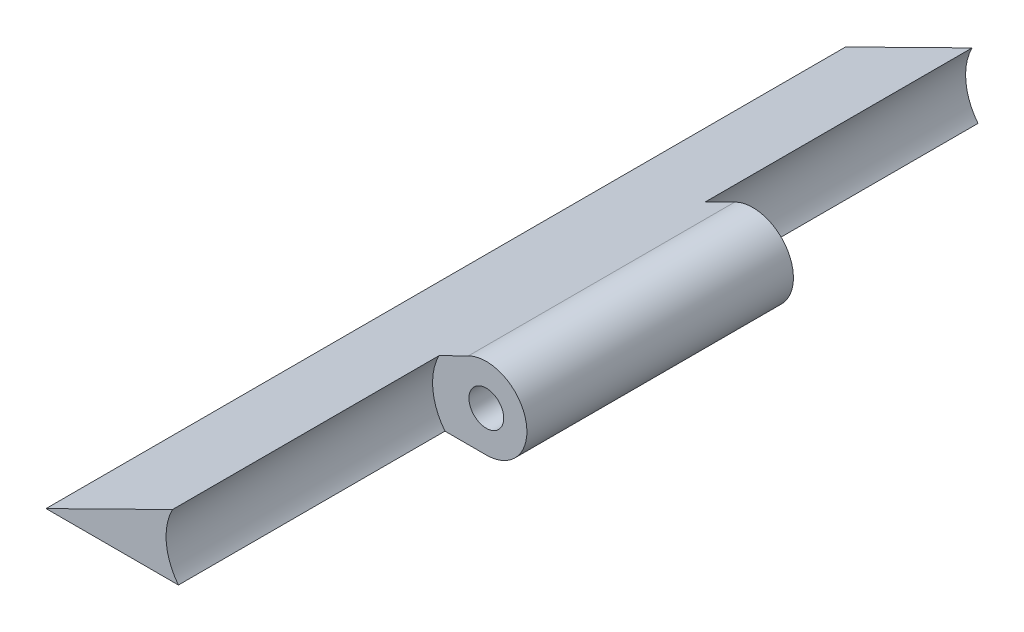
ISO-10303-21;
HEADER;
FILE_DESCRIPTION(('STEP AP214'),'2;1');
FILE_NAME('part.step','',(''),(''),'','','');
FILE_SCHEMA(('AUTOMOTIVE_DESIGN { 1 0 10303 214 1 1 1 1 }'));
ENDSEC;
DATA;
#1=APPLICATION_CONTEXT('core data for automotive mechanical design processes');
#2=APPLICATION_PROTOCOL_DEFINITION('international standard','automotive_design',2000,#1);
#3=PRODUCT_CONTEXT('',#1,'mechanical');
#4=PRODUCT('Part','Part','',(#3));
#5=PRODUCT_RELATED_PRODUCT_CATEGORY('part','',(#4));
#6=PRODUCT_DEFINITION_FORMATION('','',#4);
#7=PRODUCT_DEFINITION_CONTEXT('part definition',#1,'design');
#8=PRODUCT_DEFINITION('design','',#6,#7);
#9=PRODUCT_DEFINITION_SHAPE('','',#8);
#10=(LENGTH_UNIT() NAMED_UNIT(*) SI_UNIT(.MILLI.,.METRE.));
#11=(NAMED_UNIT(*) PLANE_ANGLE_UNIT() SI_UNIT($,.RADIAN.));
#12=(NAMED_UNIT(*) SI_UNIT($,.STERADIAN.) SOLID_ANGLE_UNIT());
#13=UNCERTAINTY_MEASURE_WITH_UNIT(LENGTH_MEASURE(1.E-05),#10,'distance_accuracy_value','');
#14=(GEOMETRIC_REPRESENTATION_CONTEXT(3) GLOBAL_UNCERTAINTY_ASSIGNED_CONTEXT((#13)) GLOBAL_UNIT_ASSIGNED_CONTEXT((#10,
#11,#12)) REPRESENTATION_CONTEXT('',''));
#15=CARTESIAN_POINT('',(0.,0.,0.));
#16=DIRECTION('',(0.,0.,1.));
#17=DIRECTION('',(1.,0.,0.));
#18=AXIS2_PLACEMENT_3D('',#15,#16,#17);
#19=CARTESIAN_POINT('',(0.,0.,11.5));
#20=DIRECTION('',(0.,0.,1.));
#21=DIRECTION('',(1.,0.,0.));
#22=AXIS2_PLACEMENT_3D('',#19,#20,#21);
#23=PLANE('',#22);
#24=CARTESIAN_POINT('',(0.,0.,11.5));
#25=DIRECTION('',(0.,0.,1.));
#26=DIRECTION('',(1.,0.,0.));
#27=AXIS2_PLACEMENT_3D('',#24,#25,#26);
#28=CIRCLE('',#27,1.5);
#29=CARTESIAN_POINT('',(1.5,0.,11.5));
#30=VERTEX_POINT('',#29);
#31=EDGE_CURVE('E156',#30,#30,#28,.T.);
#32=ORIENTED_EDGE('',*,*,#31,.F.);
#33=EDGE_LOOP('',(#32));
#34=FACE_BOUND('',#33,.T.);
#35=DIRECTION('',(-0.896733403582719,-0.442571127502634,0.));
#36=VECTOR('',#35,1.);
#37=CARTESIAN_POINT('',(-15.,-3.5,11.5));
#38=LINE('',#37,#36);
#39=CARTESIAN_POINT('',(-1.54899894625922,3.13856691253951,11.5));
#40=VERTEX_POINT('',#39);
#41=CARTESIAN_POINT('',(-4.08142423666942,1.88872129330064,11.5));
#42=VERTEX_POINT('',#41);
#43=EDGE_CURVE('E54',#40,#42,#38,.T.);
#44=ORIENTED_EDGE('',*,*,#43,.T.);
#45=CARTESIAN_POINT('',(0.359365936205238,-0.408969425769242,11.5));
#46=DIRECTION('',(0.,0.,1.));
#47=DIRECTION('',(1.,0.,0.));
#48=AXIS2_PLACEMENT_3D('',#45,#46,#47);
#49=CIRCLE('',#48,5.);
#50=CARTESIAN_POINT('',(-3.57071421427142,-3.5,11.5));
#51=VERTEX_POINT('',#50);
#52=EDGE_CURVE('E58',#42,#51,#49,.T.);
#53=ORIENTED_EDGE('',*,*,#52,.T.);
#54=DIRECTION('',(1.,0.,0.));
#55=VECTOR('',#54,1.);
#56=CARTESIAN_POINT('',(0.,-3.5,11.5));
#57=LINE('',#56,#55);
#58=CARTESIAN_POINT('',(0.,-3.5,11.5));
#59=VERTEX_POINT('',#58);
#60=EDGE_CURVE('E136',#51,#59,#57,.T.);
#61=ORIENTED_EDGE('',*,*,#60,.T.);
#62=CARTESIAN_POINT('',(0.,0.,11.5));
#63=DIRECTION('',(0.,0.,1.));
#64=DIRECTION('',(1.,0.,0.));
#65=AXIS2_PLACEMENT_3D('',#62,#63,#64);
#66=CIRCLE('',#65,3.5);
#67=EDGE_CURVE('E11',#59,#40,#66,.T.);
#68=ORIENTED_EDGE('',*,*,#67,.T.);
#69=EDGE_LOOP('',(#44,#53,#61,#68));
#70=FACE_BOUND('',#69,.T.);
#71=ADVANCED_FACE('F39',(#34,#70),#23,.T.);
#72=CARTESIAN_POINT('',(0.,0.,-11.5));
#73=DIRECTION('',(0.,0.,1.));
#74=DIRECTION('',(1.,0.,0.));
#75=AXIS2_PLACEMENT_3D('',#72,#73,#74);
#76=PLANE('',#75);
#77=CARTESIAN_POINT('',(0.,0.,-11.5));
#78=DIRECTION('',(0.,0.,1.));
#79=DIRECTION('',(1.,0.,0.));
#80=AXIS2_PLACEMENT_3D('',#77,#78,#79);
#81=CIRCLE('',#80,1.5);
#82=CARTESIAN_POINT('',(1.5,0.,-11.5));
#83=VERTEX_POINT('',#82);
#84=EDGE_CURVE('E155',#83,#83,#81,.T.);
#85=ORIENTED_EDGE('',*,*,#84,.T.);
#86=EDGE_LOOP('',(#85));
#87=FACE_BOUND('',#86,.T.);
#88=CARTESIAN_POINT('',(0.359365936205238,-0.408969425769242,-11.5));
#89=DIRECTION('',(0.,0.,1.));
#90=DIRECTION('',(1.,0.,0.));
#91=AXIS2_PLACEMENT_3D('',#88,#89,#90);
#92=CIRCLE('',#91,5.);
#93=CARTESIAN_POINT('',(-4.08142423666942,1.88872129330063,-11.5));
#94=VERTEX_POINT('',#93);
#95=CARTESIAN_POINT('',(-3.57071421427142,-3.5,-11.5));
#96=VERTEX_POINT('',#95);
#97=EDGE_CURVE('E120',#94,#96,#92,.T.);
#98=ORIENTED_EDGE('',*,*,#97,.F.);
#99=DIRECTION('',(-0.896733403582719,-0.442571127502634,0.));
#100=VECTOR('',#99,1.);
#101=CARTESIAN_POINT('',(-15.,-3.5,-11.5));
#102=LINE('',#101,#100);
#103=CARTESIAN_POINT('',(-1.54899894625922,3.13856691253951,-11.5));
#104=VERTEX_POINT('',#103);
#105=EDGE_CURVE('E133',#104,#94,#102,.T.);
#106=ORIENTED_EDGE('',*,*,#105,.F.);
#107=CARTESIAN_POINT('',(0.,0.,-11.5));
#108=DIRECTION('',(0.,0.,1.));
#109=DIRECTION('',(1.,0.,0.));
#110=AXIS2_PLACEMENT_3D('',#107,#108,#109);
#111=CIRCLE('',#110,3.5);
#112=CARTESIAN_POINT('',(0.,-3.5,-11.5));
#113=VERTEX_POINT('',#112);
#114=EDGE_CURVE('E43',#113,#104,#111,.T.);
#115=ORIENTED_EDGE('',*,*,#114,.F.);
#116=DIRECTION('',(1.,0.,0.));
#117=VECTOR('',#116,1.);
#118=CARTESIAN_POINT('',(0.,-3.5,-11.5));
#119=LINE('',#118,#117);
#120=EDGE_CURVE('E137',#96,#113,#119,.T.);
#121=ORIENTED_EDGE('',*,*,#120,.F.);
#122=EDGE_LOOP('',(#98,#106,#115,#121));
#123=FACE_BOUND('',#122,.T.);
#124=ADVANCED_FACE('F164',(#87,#123),#76,.F.);
#125=CARTESIAN_POINT('',(0.,0.,11.5));
#126=DIRECTION('',(0.,0.,-1.));
#127=DIRECTION('',(-1.,0.,0.));
#128=AXIS2_PLACEMENT_3D('',#125,#126,#127);
#129=CYLINDRICAL_SURFACE('',#128,3.5);
#130=DIRECTION('',(0.,0.,-1.));
#131=VECTOR('',#130,1.);
#132=CARTESIAN_POINT('',(-1.54899894625922,3.13856691253952,11.5));
#133=LINE('',#132,#131);
#134=EDGE_CURVE('E140',#40,#104,#133,.T.);
#135=ORIENTED_EDGE('',*,*,#134,.F.);
#136=ORIENTED_EDGE('',*,*,#67,.F.);
#137=DIRECTION('',(0.,0.,-1.));
#138=VECTOR('',#137,1.);
#139=CARTESIAN_POINT('',(0.,-3.5,11.5));
#140=LINE('',#139,#138);
#141=EDGE_CURVE('E149',#59,#113,#140,.T.);
#142=ORIENTED_EDGE('',*,*,#141,.T.);
#143=ORIENTED_EDGE('',*,*,#114,.T.);
#144=EDGE_LOOP('',(#135,#136,#142,#143));
#145=FACE_BOUND('',#144,.T.);
#146=ADVANCED_FACE('F41',(#145),#129,.T.);
#147=CARTESIAN_POINT('',(0.,0.,11.5));
#148=DIRECTION('',(0.,0.,-1.));
#149=DIRECTION('',(-1.,0.,0.));
#150=AXIS2_PLACEMENT_3D('',#147,#148,#149);
#151=CYLINDRICAL_SURFACE('',#150,1.5);
#152=ORIENTED_EDGE('',*,*,#31,.T.);
#153=EDGE_LOOP('',(#152));
#154=FACE_BOUND('',#153,.T.);
#155=ORIENTED_EDGE('',*,*,#84,.F.);
#156=EDGE_LOOP('',(#155));
#157=FACE_BOUND('',#156,.T.);
#158=ADVANCED_FACE('F167',(#154,#157),#151,.F.);
#159=CARTESIAN_POINT('',(-15.,-3.5,11.5));
#160=DIRECTION('',(0.442571127502634,-0.896733403582719,0.));
#161=DIRECTION('',(0.896733403582719,0.442571127502634,0.));
#162=AXIS2_PLACEMENT_3D('',#159,#160,#161);
#163=PLANE('',#162);
#164=DIRECTION('',(0.,0.,-1.));
#165=VECTOR('',#164,1.);
#166=CARTESIAN_POINT('',(-15.,-3.5,11.5));
#167=LINE('',#166,#165);
#168=CARTESIAN_POINT('',(-15.,-3.5,34.5));
#169=VERTEX_POINT('',#168);
#170=CARTESIAN_POINT('',(-15.,-3.5,-34.5));
#171=VERTEX_POINT('',#170);
#172=EDGE_CURVE('E104',#169,#171,#167,.T.);
#173=ORIENTED_EDGE('',*,*,#172,.F.);
#174=DIRECTION('',(0.896733403582719,0.442571127502634,0.));
#175=VECTOR('',#174,1.);
#176=CARTESIAN_POINT('',(-15.,-3.5,34.5));
#177=LINE('',#176,#175);
#178=CARTESIAN_POINT('',(-4.08142423666942,1.88872129330063,34.5));
#179=VERTEX_POINT('',#178);
#180=EDGE_CURVE('E116',#169,#179,#177,.T.);
#181=ORIENTED_EDGE('',*,*,#180,.T.);
#182=DIRECTION('',(0.,0.,1.));
#183=VECTOR('',#182,1.);
#184=CARTESIAN_POINT('',(-4.08142423666942,1.88872129330063,-34.5));
#185=LINE('',#184,#183);
#186=EDGE_CURVE('E276',#42,#179,#185,.T.);
#187=ORIENTED_EDGE('',*,*,#186,.F.);
#188=ORIENTED_EDGE('',*,*,#43,.F.);
#189=ORIENTED_EDGE('',*,*,#134,.T.);
#190=ORIENTED_EDGE('',*,*,#105,.T.);
#191=CARTESIAN_POINT('',(-4.08142423666942,1.88872129330063,-34.5));
#192=VERTEX_POINT('',#191);
#193=EDGE_CURVE('E127',#192,#94,#185,.T.);
#194=ORIENTED_EDGE('',*,*,#193,.F.);
#195=DIRECTION('',(0.896733403582719,0.442571127502634,0.));
#196=VECTOR('',#195,1.);
#197=CARTESIAN_POINT('',(-15.,-3.5,-34.5));
#198=LINE('',#197,#196);
#199=EDGE_CURVE('E108',#171,#192,#198,.T.);
#200=ORIENTED_EDGE('',*,*,#199,.F.);
#201=EDGE_LOOP('',(#173,#181,#187,#188,#189,#190,#194,#200));
#202=FACE_BOUND('',#201,.T.);
#203=ADVANCED_FACE('F169',(#202),#163,.F.);
#204=CARTESIAN_POINT('',(0.,-3.5,11.5));
#205=DIRECTION('',(0.,1.,0.));
#206=DIRECTION('',(-1.,0.,0.));
#207=AXIS2_PLACEMENT_3D('',#204,#205,#206);
#208=PLANE('',#207);
#209=ORIENTED_EDGE('',*,*,#172,.T.);
#210=DIRECTION('',(-1.,0.,0.));
#211=VECTOR('',#210,1.);
#212=CARTESIAN_POINT('',(-3.57071421427142,-3.5,-34.5));
#213=LINE('',#212,#211);
#214=CARTESIAN_POINT('',(-3.57071421427142,-3.5,-34.5));
#215=VERTEX_POINT('',#214);
#216=EDGE_CURVE('E97',#215,#171,#213,.T.);
#217=ORIENTED_EDGE('',*,*,#216,.F.);
#218=DIRECTION('',(0.,0.,1.));
#219=VECTOR('',#218,1.);
#220=CARTESIAN_POINT('',(-3.57071421427142,-3.5,-34.5));
#221=LINE('',#220,#219);
#222=EDGE_CURVE('E101',#215,#96,#221,.T.);
#223=ORIENTED_EDGE('',*,*,#222,.T.);
#224=ORIENTED_EDGE('',*,*,#120,.T.);
#225=ORIENTED_EDGE('',*,*,#141,.F.);
#226=ORIENTED_EDGE('',*,*,#60,.F.);
#227=CARTESIAN_POINT('',(-3.57071421427142,-3.5,34.5));
#228=VERTEX_POINT('',#227);
#229=EDGE_CURVE('E122',#51,#228,#221,.T.);
#230=ORIENTED_EDGE('',*,*,#229,.T.);
#231=DIRECTION('',(-1.,0.,0.));
#232=VECTOR('',#231,1.);
#233=CARTESIAN_POINT('',(-3.57071421427142,-3.5,34.5));
#234=LINE('',#233,#232);
#235=EDGE_CURVE('E267',#228,#169,#234,.T.);
#236=ORIENTED_EDGE('',*,*,#235,.T.);
#237=EDGE_LOOP('',(#209,#217,#223,#224,#225,#226,#230,#236));
#238=FACE_BOUND('',#237,.T.);
#239=ADVANCED_FACE('F99',(#238),#208,.F.);
#240=CARTESIAN_POINT('',(0.359365936205238,-0.408969425769242,-34.5));
#241=DIRECTION('',(0.,0.,1.));
#242=DIRECTION('',(1.,0.,0.));
#243=AXIS2_PLACEMENT_3D('',#240,#241,#242);
#244=PLANE('',#243);
#245=CARTESIAN_POINT('',(0.359365936205238,-0.408969425769242,-34.5));
#246=DIRECTION('',(0.,0.,1.));
#247=DIRECTION('',(1.,0.,0.));
#248=AXIS2_PLACEMENT_3D('',#245,#246,#247);
#249=CIRCLE('',#248,5.);
#250=EDGE_CURVE('E109',#192,#215,#249,.T.);
#251=ORIENTED_EDGE('',*,*,#250,.T.);
#252=ORIENTED_EDGE('',*,*,#216,.T.);
#253=ORIENTED_EDGE('',*,*,#199,.T.);
#254=EDGE_LOOP('',(#251,#252,#253));
#255=FACE_BOUND('',#254,.T.);
#256=ADVANCED_FACE('F112',(#255),#244,.F.);
#257=CARTESIAN_POINT('',(0.359365936205238,-0.408969425769242,-34.5));
#258=DIRECTION('',(0.,0.,1.));
#259=DIRECTION('',(1.,0.,0.));
#260=AXIS2_PLACEMENT_3D('',#257,#258,#259);
#261=CYLINDRICAL_SURFACE('',#260,5.);
#262=ORIENTED_EDGE('',*,*,#193,.T.);
#263=ORIENTED_EDGE('',*,*,#97,.T.);
#264=ORIENTED_EDGE('',*,*,#222,.F.);
#265=ORIENTED_EDGE('',*,*,#250,.F.);
#266=EDGE_LOOP('',(#262,#263,#264,#265));
#267=FACE_BOUND('',#266,.T.);
#268=ADVANCED_FACE('F118',(#267),#261,.F.);
#269=ORIENTED_EDGE('',*,*,#52,.F.);
#270=ORIENTED_EDGE('',*,*,#186,.T.);
#271=CARTESIAN_POINT('',(0.359365936205238,-0.408969425769242,34.5));
#272=DIRECTION('',(0.,0.,1.));
#273=DIRECTION('',(1.,0.,0.));
#274=AXIS2_PLACEMENT_3D('',#271,#272,#273);
#275=CIRCLE('',#274,5.);
#276=EDGE_CURVE('E265',#179,#228,#275,.T.);
#277=ORIENTED_EDGE('',*,*,#276,.T.);
#278=ORIENTED_EDGE('',*,*,#229,.F.);
#279=EDGE_LOOP('',(#269,#270,#277,#278));
#280=FACE_BOUND('',#279,.T.);
#281=ADVANCED_FACE('F237',(#280),#261,.F.);
#282=CARTESIAN_POINT('',(0.359365936205238,-0.408969425769242,34.5));
#283=DIRECTION('',(0.,0.,1.));
#284=DIRECTION('',(1.,0.,0.));
#285=AXIS2_PLACEMENT_3D('',#282,#283,#284);
#286=PLANE('',#285);
#287=ORIENTED_EDGE('',*,*,#276,.F.);
#288=ORIENTED_EDGE('',*,*,#180,.F.);
#289=ORIENTED_EDGE('',*,*,#235,.F.);
#290=EDGE_LOOP('',(#287,#288,#289));
#291=FACE_BOUND('',#290,.T.);
#292=ADVANCED_FACE('F245',(#291),#286,.T.);
#293=CLOSED_SHELL('',(#71,#124,#146,#158,#203,#239,#256,#268,#281,#292));
#294=MANIFOLD_SOLID_BREP('B2',#293);
#295=ADVANCED_BREP_SHAPE_REPRESENTATION('',(#18,#294),#14);
#296=SHAPE_DEFINITION_REPRESENTATION(#9,#295);
ENDSEC;
END-ISO-10303-21;
